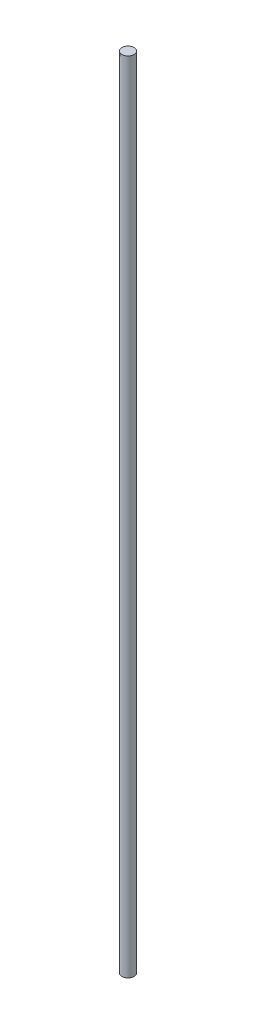
ISO-10303-21;
HEADER;
FILE_DESCRIPTION(('STEP AP214'),'2;1');
FILE_NAME('part.step','',(''),(''),'','','');
FILE_SCHEMA(('AUTOMOTIVE_DESIGN { 1 0 10303 214 1 1 1 1 }'));
ENDSEC;
DATA;
#1=APPLICATION_CONTEXT('core data for automotive mechanical design processes');
#2=APPLICATION_PROTOCOL_DEFINITION('international standard','automotive_design',2000,#1);
#3=PRODUCT_CONTEXT('',#1,'mechanical');
#4=PRODUCT('Part','Part','',(#3));
#5=PRODUCT_RELATED_PRODUCT_CATEGORY('part','',(#4));
#6=PRODUCT_DEFINITION_FORMATION('','',#4);
#7=PRODUCT_DEFINITION_CONTEXT('part definition',#1,'design');
#8=PRODUCT_DEFINITION('design','',#6,#7);
#9=PRODUCT_DEFINITION_SHAPE('','',#8);
#10=(LENGTH_UNIT() NAMED_UNIT(*) SI_UNIT(.MILLI.,.METRE.));
#11=(NAMED_UNIT(*) PLANE_ANGLE_UNIT() SI_UNIT($,.RADIAN.));
#12=(NAMED_UNIT(*) SI_UNIT($,.STERADIAN.) SOLID_ANGLE_UNIT());
#13=UNCERTAINTY_MEASURE_WITH_UNIT(LENGTH_MEASURE(1.E-05),#10,'distance_accuracy_value','');
#14=(GEOMETRIC_REPRESENTATION_CONTEXT(3) GLOBAL_UNCERTAINTY_ASSIGNED_CONTEXT((#13)) GLOBAL_UNIT_ASSIGNED_CONTEXT((#10,
#11,#12)) REPRESENTATION_CONTEXT('',''));
#15=CARTESIAN_POINT('',(0.,0.,0.));
#16=DIRECTION('',(0.,0.,1.));
#17=DIRECTION('',(1.,0.,0.));
#18=AXIS2_PLACEMENT_3D('',#15,#16,#17);
#19=CARTESIAN_POINT('',(0.,400.,0.));
#20=DIRECTION('',(0.,-1.,0.));
#21=DIRECTION('',(0.,0.,-1.));
#22=AXIS2_PLACEMENT_3D('',#19,#20,#21);
#23=CYLINDRICAL_SURFACE('',#22,3.05);
#24=CARTESIAN_POINT('',(0.,400.,0.));
#25=DIRECTION('',(0.,1.,0.));
#26=DIRECTION('',(0.,0.,1.));
#27=AXIS2_PLACEMENT_3D('',#24,#25,#26);
#28=CIRCLE('',#27,3.05);
#29=CARTESIAN_POINT('',(0.,400.,3.05));
#30=VERTEX_POINT('',#29);
#31=EDGE_CURVE('E10',#30,#30,#28,.T.);
#32=ORIENTED_EDGE('',*,*,#31,.F.);
#33=EDGE_LOOP('',(#32));
#34=FACE_BOUND('',#33,.T.);
#35=CARTESIAN_POINT('',(0.,0.,0.));
#36=DIRECTION('',(0.,1.,0.));
#37=DIRECTION('',(0.,0.,1.));
#38=AXIS2_PLACEMENT_3D('',#35,#36,#37);
#39=CIRCLE('',#38,3.05);
#40=CARTESIAN_POINT('',(0.,0.,3.05));
#41=VERTEX_POINT('',#40);
#42=EDGE_CURVE('E37',#41,#41,#39,.T.);
#43=ORIENTED_EDGE('',*,*,#42,.T.);
#44=EDGE_LOOP('',(#43));
#45=FACE_BOUND('',#44,.T.);
#46=ADVANCED_FACE('F34',(#34,#45),#23,.T.);
#47=CARTESIAN_POINT('',(0.,400.,0.));
#48=DIRECTION('',(0.,1.,0.));
#49=DIRECTION('',(0.,0.,1.));
#50=AXIS2_PLACEMENT_3D('',#47,#48,#49);
#51=PLANE('',#50);
#52=ORIENTED_EDGE('',*,*,#31,.T.);
#53=EDGE_LOOP('',(#52));
#54=FACE_BOUND('',#53,.T.);
#55=ADVANCED_FACE('F49',(#54),#51,.T.);
#56=CARTESIAN_POINT('',(0.,0.,0.));
#57=DIRECTION('',(0.,1.,0.));
#58=DIRECTION('',(0.,0.,1.));
#59=AXIS2_PLACEMENT_3D('',#56,#57,#58);
#60=PLANE('',#59);
#61=ORIENTED_EDGE('',*,*,#42,.F.);
#62=EDGE_LOOP('',(#61));
#63=FACE_BOUND('',#62,.T.);
#64=ADVANCED_FACE('F47',(#63),#60,.F.);
#65=CLOSED_SHELL('',(#46,#55,#64));
#66=MANIFOLD_SOLID_BREP('B2',#65);
#67=ADVANCED_BREP_SHAPE_REPRESENTATION('',(#18,#66),#14);
#68=SHAPE_DEFINITION_REPRESENTATION(#9,#67);
ENDSEC;
END-ISO-10303-21;
